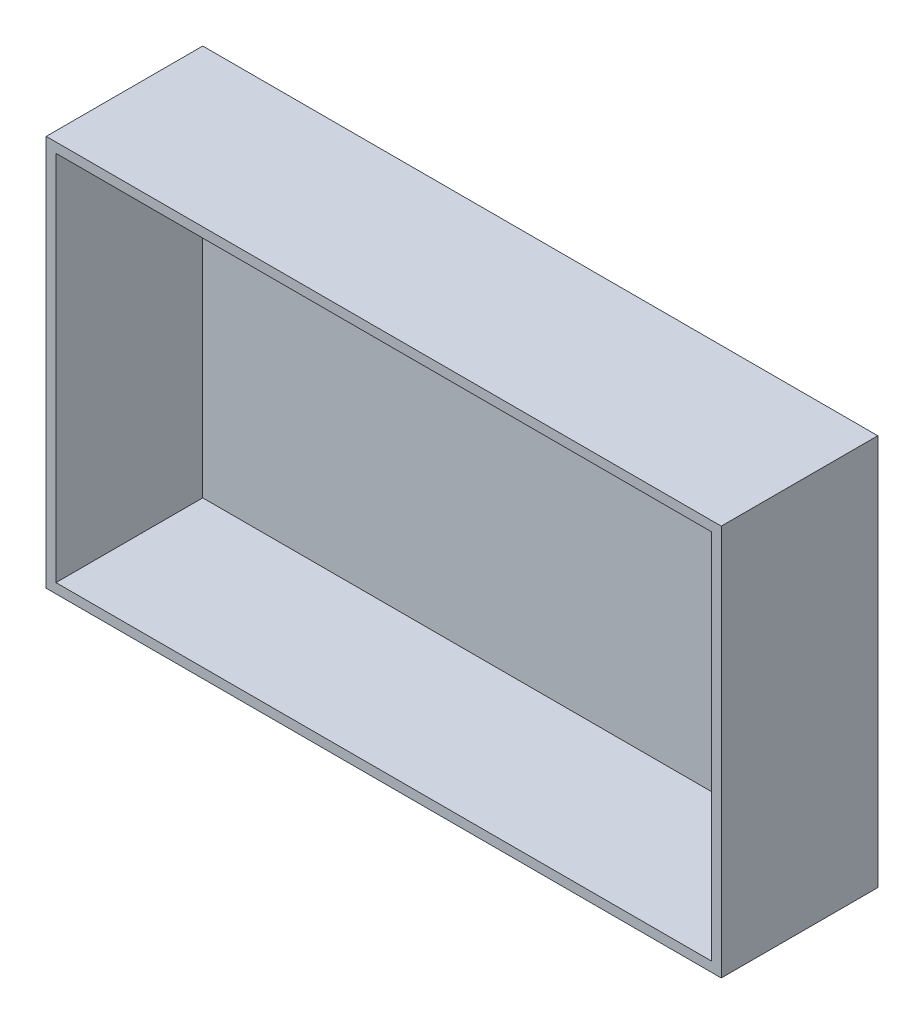
ISO-10303-21;
HEADER;
FILE_DESCRIPTION(('STEP AP214'),'2;1');
FILE_NAME('part.step','',(''),(''),'','','');
FILE_SCHEMA(('AUTOMOTIVE_DESIGN { 1 0 10303 214 1 1 1 1 }'));
ENDSEC;
DATA;
#1=APPLICATION_CONTEXT('core data for automotive mechanical design processes');
#2=APPLICATION_PROTOCOL_DEFINITION('international standard','automotive_design',2000,#1);
#3=PRODUCT_CONTEXT('',#1,'mechanical');
#4=PRODUCT('Part','Part','',(#3));
#5=PRODUCT_RELATED_PRODUCT_CATEGORY('part','',(#4));
#6=PRODUCT_DEFINITION_FORMATION('','',#4);
#7=PRODUCT_DEFINITION_CONTEXT('part definition',#1,'design');
#8=PRODUCT_DEFINITION('design','',#6,#7);
#9=PRODUCT_DEFINITION_SHAPE('','',#8);
#10=(LENGTH_UNIT() NAMED_UNIT(*) SI_UNIT(.MILLI.,.METRE.));
#11=(NAMED_UNIT(*) PLANE_ANGLE_UNIT() SI_UNIT($,.RADIAN.));
#12=(NAMED_UNIT(*) SI_UNIT($,.STERADIAN.) SOLID_ANGLE_UNIT());
#13=UNCERTAINTY_MEASURE_WITH_UNIT(LENGTH_MEASURE(1.E-05),#10,'distance_accuracy_value','');
#14=(GEOMETRIC_REPRESENTATION_CONTEXT(3) GLOBAL_UNCERTAINTY_ASSIGNED_CONTEXT((#13)) GLOBAL_UNIT_ASSIGNED_CONTEXT((#10,
#11,#12)) REPRESENTATION_CONTEXT('',''));
#15=CARTESIAN_POINT('',(0.,0.,0.));
#16=DIRECTION('',(0.,0.,1.));
#17=DIRECTION('',(1.,0.,0.));
#18=AXIS2_PLACEMENT_3D('',#15,#16,#17);
#19=CARTESIAN_POINT('',(345.,200.,10.));
#20=DIRECTION('',(-1.,0.,0.));
#21=DIRECTION('',(0.,0.,1.));
#22=AXIS2_PLACEMENT_3D('',#19,#20,#21);
#23=PLANE('',#22);
#24=DIRECTION('',(0.,1.,0.));
#25=VECTOR('',#24,1.);
#26=CARTESIAN_POINT('',(345.,200.,0.));
#27=LINE('',#26,#25);
#28=CARTESIAN_POINT('',(345.,-200.,0.));
#29=VERTEX_POINT('',#28);
#30=CARTESIAN_POINT('',(345.,200.,0.));
#31=VERTEX_POINT('',#30);
#32=EDGE_CURVE('E144',#29,#31,#27,.T.);
#33=ORIENTED_EDGE('',*,*,#32,.T.);
#34=DIRECTION('',(0.,0.,-1.));
#35=VECTOR('',#34,1.);
#36=CARTESIAN_POINT('',(345.,200.,10.));
#37=LINE('',#36,#35);
#38=CARTESIAN_POINT('',(345.,200.,160.));
#39=VERTEX_POINT('',#38);
#40=EDGE_CURVE('E11',#39,#31,#37,.T.);
#41=ORIENTED_EDGE('',*,*,#40,.F.);
#42=DIRECTION('',(0.,1.,0.));
#43=VECTOR('',#42,1.);
#44=CARTESIAN_POINT('',(345.,-200.,160.));
#45=LINE('',#44,#43);
#46=CARTESIAN_POINT('',(345.,-200.,160.));
#47=VERTEX_POINT('',#46);
#48=EDGE_CURVE('E135',#47,#39,#45,.T.);
#49=ORIENTED_EDGE('',*,*,#48,.F.);
#50=DIRECTION('',(0.,0.,-1.));
#51=VECTOR('',#50,1.);
#52=CARTESIAN_POINT('',(345.,-200.,10.));
#53=LINE('',#52,#51);
#54=EDGE_CURVE('E153',#47,#29,#53,.T.);
#55=ORIENTED_EDGE('',*,*,#54,.T.);
#56=EDGE_LOOP('',(#33,#41,#49,#55));
#57=FACE_BOUND('',#56,.T.);
#58=ADVANCED_FACE('F33',(#57),#23,.F.);
#59=CARTESIAN_POINT('',(-345.,200.,10.));
#60=DIRECTION('',(0.,-1.,0.));
#61=DIRECTION('',(0.,0.,-1.));
#62=AXIS2_PLACEMENT_3D('',#59,#60,#61);
#63=PLANE('',#62);
#64=DIRECTION('',(-1.,0.,0.));
#65=VECTOR('',#64,1.);
#66=CARTESIAN_POINT('',(-345.,200.,0.));
#67=LINE('',#66,#65);
#68=CARTESIAN_POINT('',(-345.,200.,0.));
#69=VERTEX_POINT('',#68);
#70=EDGE_CURVE('E147',#31,#69,#67,.T.);
#71=ORIENTED_EDGE('',*,*,#70,.T.);
#72=DIRECTION('',(0.,0.,-1.));
#73=VECTOR('',#72,1.);
#74=CARTESIAN_POINT('',(-345.,200.,10.));
#75=LINE('',#74,#73);
#76=CARTESIAN_POINT('',(-345.,200.,160.));
#77=VERTEX_POINT('',#76);
#78=EDGE_CURVE('E40',#77,#69,#75,.T.);
#79=ORIENTED_EDGE('',*,*,#78,.F.);
#80=DIRECTION('',(-1.,0.,0.));
#81=VECTOR('',#80,1.);
#82=CARTESIAN_POINT('',(345.,200.,160.));
#83=LINE('',#82,#81);
#84=EDGE_CURVE('E138',#39,#77,#83,.T.);
#85=ORIENTED_EDGE('',*,*,#84,.F.);
#86=ORIENTED_EDGE('',*,*,#40,.T.);
#87=EDGE_LOOP('',(#71,#79,#85,#86));
#88=FACE_BOUND('',#87,.T.);
#89=ADVANCED_FACE('F175',(#88),#63,.F.);
#90=CARTESIAN_POINT('',(-345.,200.,10.));
#91=DIRECTION('',(1.,0.,0.));
#92=DIRECTION('',(0.,1.,0.));
#93=AXIS2_PLACEMENT_3D('',#90,#91,#92);
#94=PLANE('',#93);
#95=DIRECTION('',(0.,-1.,0.));
#96=VECTOR('',#95,1.);
#97=CARTESIAN_POINT('',(-345.,200.,0.));
#98=LINE('',#97,#96);
#99=CARTESIAN_POINT('',(-345.,-200.,0.));
#100=VERTEX_POINT('',#99);
#101=EDGE_CURVE('E149',#69,#100,#98,.T.);
#102=ORIENTED_EDGE('',*,*,#101,.T.);
#103=DIRECTION('',(0.,0.,-1.));
#104=VECTOR('',#103,1.);
#105=CARTESIAN_POINT('',(-345.,-200.,10.));
#106=LINE('',#105,#104);
#107=CARTESIAN_POINT('',(-345.,-200.,160.));
#108=VERTEX_POINT('',#107);
#109=EDGE_CURVE('E156',#108,#100,#106,.T.);
#110=ORIENTED_EDGE('',*,*,#109,.F.);
#111=DIRECTION('',(0.,-1.,0.));
#112=VECTOR('',#111,1.);
#113=CARTESIAN_POINT('',(-345.,200.,160.));
#114=LINE('',#113,#112);
#115=EDGE_CURVE('E141',#77,#108,#114,.T.);
#116=ORIENTED_EDGE('',*,*,#115,.F.);
#117=ORIENTED_EDGE('',*,*,#78,.T.);
#118=EDGE_LOOP('',(#102,#110,#116,#117));
#119=FACE_BOUND('',#118,.T.);
#120=ADVANCED_FACE('F162',(#119),#94,.F.);
#121=CARTESIAN_POINT('',(-345.,-200.,10.));
#122=DIRECTION('',(0.,1.,0.));
#123=DIRECTION('',(0.,0.,1.));
#124=AXIS2_PLACEMENT_3D('',#121,#122,#123);
#125=PLANE('',#124);
#126=DIRECTION('',(1.,0.,0.));
#127=VECTOR('',#126,1.);
#128=CARTESIAN_POINT('',(-345.,-200.,0.));
#129=LINE('',#128,#127);
#130=EDGE_CURVE('E151',#100,#29,#129,.T.);
#131=ORIENTED_EDGE('',*,*,#130,.T.);
#132=ORIENTED_EDGE('',*,*,#54,.F.);
#133=DIRECTION('',(1.,0.,0.));
#134=VECTOR('',#133,1.);
#135=CARTESIAN_POINT('',(-345.,-200.,160.));
#136=LINE('',#135,#134);
#137=EDGE_CURVE('E111',#108,#47,#136,.T.);
#138=ORIENTED_EDGE('',*,*,#137,.F.);
#139=ORIENTED_EDGE('',*,*,#109,.T.);
#140=EDGE_LOOP('',(#131,#132,#138,#139));
#141=FACE_BOUND('',#140,.T.);
#142=ADVANCED_FACE('F170',(#141),#125,.F.);
#143=CARTESIAN_POINT('',(0.,0.,0.));
#144=DIRECTION('',(0.,0.,1.));
#145=DIRECTION('',(1.,0.,0.));
#146=AXIS2_PLACEMENT_3D('',#143,#144,#145);
#147=PLANE('',#146);
#148=ORIENTED_EDGE('',*,*,#32,.F.);
#149=ORIENTED_EDGE('',*,*,#130,.F.);
#150=ORIENTED_EDGE('',*,*,#101,.F.);
#151=ORIENTED_EDGE('',*,*,#70,.F.);
#152=EDGE_LOOP('',(#148,#149,#150,#151));
#153=FACE_BOUND('',#152,.T.);
#154=ADVANCED_FACE('F168',(#153),#147,.F.);
#155=CARTESIAN_POINT('',(0.,0.,160.));
#156=DIRECTION('',(0.,0.,1.));
#157=DIRECTION('',(1.,0.,0.));
#158=AXIS2_PLACEMENT_3D('',#155,#156,#157);
#159=PLANE('',#158);
#160=ORIENTED_EDGE('',*,*,#137,.T.);
#161=ORIENTED_EDGE('',*,*,#48,.T.);
#162=ORIENTED_EDGE('',*,*,#84,.T.);
#163=ORIENTED_EDGE('',*,*,#115,.T.);
#164=EDGE_LOOP('',(#160,#161,#162,#163));
#165=FACE_BOUND('',#164,.T.);
#166=DIRECTION('',(0.,1.,0.));
#167=VECTOR('',#166,1.);
#168=CARTESIAN_POINT('',(335.,-190.,160.));
#169=LINE('',#168,#167);
#170=CARTESIAN_POINT('',(335.,-190.,160.));
#171=VERTEX_POINT('',#170);
#172=CARTESIAN_POINT('',(335.,190.,160.));
#173=VERTEX_POINT('',#172);
#174=EDGE_CURVE('E105',#171,#173,#169,.T.);
#175=ORIENTED_EDGE('',*,*,#174,.F.);
#176=DIRECTION('',(1.,0.,0.));
#177=VECTOR('',#176,1.);
#178=CARTESIAN_POINT('',(-335.,-190.,160.));
#179=LINE('',#178,#177);
#180=CARTESIAN_POINT('',(-335.,-190.,160.));
#181=VERTEX_POINT('',#180);
#182=EDGE_CURVE('E96',#181,#171,#179,.T.);
#183=ORIENTED_EDGE('',*,*,#182,.F.);
#184=DIRECTION('',(0.,-1.,0.));
#185=VECTOR('',#184,1.);
#186=CARTESIAN_POINT('',(-335.,190.,160.));
#187=LINE('',#186,#185);
#188=CARTESIAN_POINT('',(-335.,190.,160.));
#189=VERTEX_POINT('',#188);
#190=EDGE_CURVE('E119',#189,#181,#187,.T.);
#191=ORIENTED_EDGE('',*,*,#190,.F.);
#192=DIRECTION('',(-1.,0.,0.));
#193=VECTOR('',#192,1.);
#194=CARTESIAN_POINT('',(335.,190.,160.));
#195=LINE('',#194,#193);
#196=EDGE_CURVE('E117',#173,#189,#195,.T.);
#197=ORIENTED_EDGE('',*,*,#196,.F.);
#198=EDGE_LOOP('',(#175,#183,#191,#197));
#199=FACE_BOUND('',#198,.T.);
#200=ADVANCED_FACE('F115',(#165,#199),#159,.T.);
#201=CARTESIAN_POINT('',(-335.,-190.,160.));
#202=DIRECTION('',(0.,1.,0.));
#203=DIRECTION('',(0.,0.,1.));
#204=AXIS2_PLACEMENT_3D('',#201,#202,#203);
#205=PLANE('',#204);
#206=DIRECTION('',(1.,0.,0.));
#207=VECTOR('',#206,1.);
#208=CARTESIAN_POINT('',(-335.,-190.,10.));
#209=LINE('',#208,#207);
#210=CARTESIAN_POINT('',(-335.,-190.,10.));
#211=VERTEX_POINT('',#210);
#212=CARTESIAN_POINT('',(335.,-190.,10.));
#213=VERTEX_POINT('',#212);
#214=EDGE_CURVE('E47',#211,#213,#209,.T.);
#215=ORIENTED_EDGE('',*,*,#214,.F.);
#216=DIRECTION('',(0.,0.,-1.));
#217=VECTOR('',#216,1.);
#218=CARTESIAN_POINT('',(-335.,-190.,160.));
#219=LINE('',#218,#217);
#220=EDGE_CURVE('E101',#181,#211,#219,.T.);
#221=ORIENTED_EDGE('',*,*,#220,.F.);
#222=ORIENTED_EDGE('',*,*,#182,.T.);
#223=DIRECTION('',(0.,0.,-1.));
#224=VECTOR('',#223,1.);
#225=CARTESIAN_POINT('',(335.,-190.,160.));
#226=LINE('',#225,#224);
#227=EDGE_CURVE('E99',#171,#213,#226,.T.);
#228=ORIENTED_EDGE('',*,*,#227,.T.);
#229=EDGE_LOOP('',(#215,#221,#222,#228));
#230=FACE_BOUND('',#229,.T.);
#231=ADVANCED_FACE('F98',(#230),#205,.T.);
#232=CARTESIAN_POINT('',(335.,-190.,160.));
#233=DIRECTION('',(-1.,0.,0.));
#234=DIRECTION('',(0.,0.,1.));
#235=AXIS2_PLACEMENT_3D('',#232,#233,#234);
#236=PLANE('',#235);
#237=DIRECTION('',(0.,1.,0.));
#238=VECTOR('',#237,1.);
#239=CARTESIAN_POINT('',(335.,-190.,10.));
#240=LINE('',#239,#238);
#241=CARTESIAN_POINT('',(335.,190.,10.));
#242=VERTEX_POINT('',#241);
#243=EDGE_CURVE('E51',#213,#242,#240,.T.);
#244=ORIENTED_EDGE('',*,*,#243,.F.);
#245=ORIENTED_EDGE('',*,*,#227,.F.);
#246=ORIENTED_EDGE('',*,*,#174,.T.);
#247=DIRECTION('',(0.,0.,-1.));
#248=VECTOR('',#247,1.);
#249=CARTESIAN_POINT('',(335.,190.,160.));
#250=LINE('',#249,#248);
#251=EDGE_CURVE('E112',#173,#242,#250,.T.);
#252=ORIENTED_EDGE('',*,*,#251,.T.);
#253=EDGE_LOOP('',(#244,#245,#246,#252));
#254=FACE_BOUND('',#253,.T.);
#255=ADVANCED_FACE('F109',(#254),#236,.T.);
#256=CARTESIAN_POINT('',(335.,190.,160.));
#257=DIRECTION('',(0.,-1.,0.));
#258=DIRECTION('',(0.,0.,-1.));
#259=AXIS2_PLACEMENT_3D('',#256,#257,#258);
#260=PLANE('',#259);
#261=DIRECTION('',(-1.,0.,0.));
#262=VECTOR('',#261,1.);
#263=CARTESIAN_POINT('',(335.,190.,10.));
#264=LINE('',#263,#262);
#265=CARTESIAN_POINT('',(-335.,190.,10.));
#266=VERTEX_POINT('',#265);
#267=EDGE_CURVE('E125',#242,#266,#264,.T.);
#268=ORIENTED_EDGE('',*,*,#267,.F.);
#269=ORIENTED_EDGE('',*,*,#251,.F.);
#270=ORIENTED_EDGE('',*,*,#196,.T.);
#271=DIRECTION('',(0.,0.,-1.));
#272=VECTOR('',#271,1.);
#273=CARTESIAN_POINT('',(-335.,190.,160.));
#274=LINE('',#273,#272);
#275=EDGE_CURVE('E129',#189,#266,#274,.T.);
#276=ORIENTED_EDGE('',*,*,#275,.T.);
#277=EDGE_LOOP('',(#268,#269,#270,#276));
#278=FACE_BOUND('',#277,.T.);
#279=ADVANCED_FACE('F197',(#278),#260,.T.);
#280=CARTESIAN_POINT('',(-335.,190.,160.));
#281=DIRECTION('',(1.,0.,0.));
#282=DIRECTION('',(0.,1.,0.));
#283=AXIS2_PLACEMENT_3D('',#280,#281,#282);
#284=PLANE('',#283);
#285=DIRECTION('',(0.,-1.,0.));
#286=VECTOR('',#285,1.);
#287=CARTESIAN_POINT('',(-335.,190.,10.));
#288=LINE('',#287,#286);
#289=EDGE_CURVE('E106',#266,#211,#288,.T.);
#290=ORIENTED_EDGE('',*,*,#289,.F.);
#291=ORIENTED_EDGE('',*,*,#275,.F.);
#292=ORIENTED_EDGE('',*,*,#190,.T.);
#293=ORIENTED_EDGE('',*,*,#220,.T.);
#294=EDGE_LOOP('',(#290,#291,#292,#293));
#295=FACE_BOUND('',#294,.T.);
#296=ADVANCED_FACE('F190',(#295),#284,.T.);
#297=CARTESIAN_POINT('',(0.,0.,10.));
#298=DIRECTION('',(0.,0.,1.));
#299=DIRECTION('',(1.,0.,0.));
#300=AXIS2_PLACEMENT_3D('',#297,#298,#299);
#301=PLANE('',#300);
#302=ORIENTED_EDGE('',*,*,#214,.T.);
#303=ORIENTED_EDGE('',*,*,#243,.T.);
#304=ORIENTED_EDGE('',*,*,#267,.T.);
#305=ORIENTED_EDGE('',*,*,#289,.T.);
#306=EDGE_LOOP('',(#302,#303,#304,#305));
#307=FACE_BOUND('',#306,.T.);
#308=ADVANCED_FACE('F187',(#307),#301,.T.);
#309=CLOSED_SHELL('',(#58,#89,#120,#142,#154,#200,#231,#255,#279,#296,#308));
#310=MANIFOLD_SOLID_BREP('B2',#309);
#311=ADVANCED_BREP_SHAPE_REPRESENTATION('',(#18,#310),#14);
#312=SHAPE_DEFINITION_REPRESENTATION(#9,#311);
ENDSEC;
END-ISO-10303-21;
